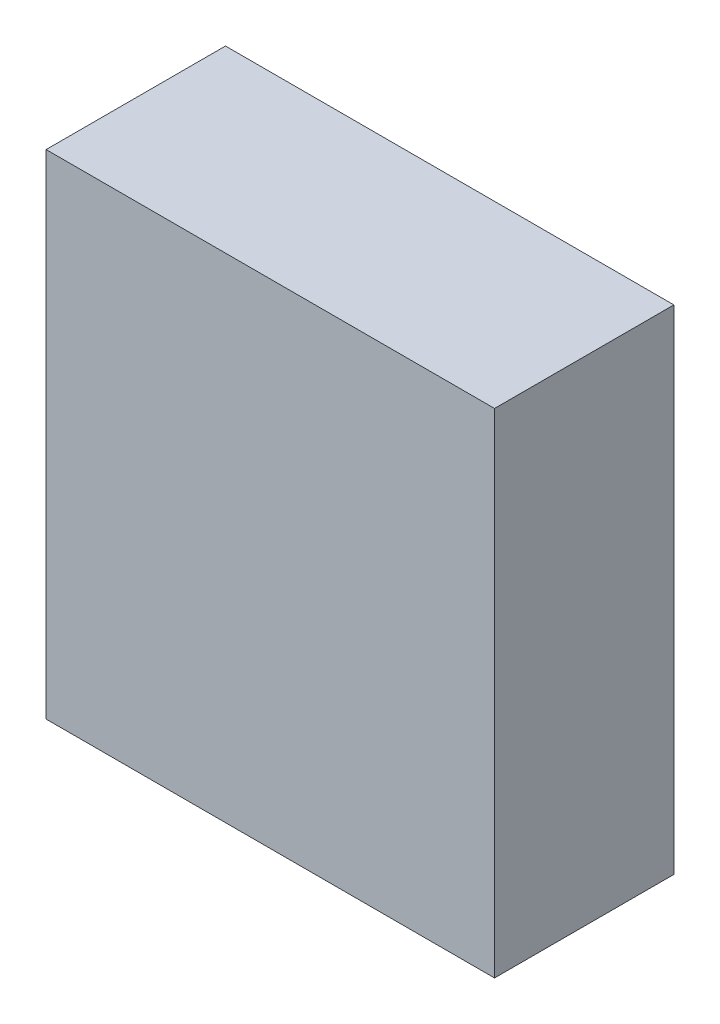
ISO-10303-21;
HEADER;
FILE_DESCRIPTION(('STEP AP214'),'2;1');
FILE_NAME('part.step','',(''),(''),'','','');
FILE_SCHEMA(('AUTOMOTIVE_DESIGN { 1 0 10303 214 1 1 1 1 }'));
ENDSEC;
DATA;
#1=APPLICATION_CONTEXT('core data for automotive mechanical design processes');
#2=APPLICATION_PROTOCOL_DEFINITION('international standard','automotive_design',2000,#1);
#3=PRODUCT_CONTEXT('',#1,'mechanical');
#4=PRODUCT('Part','Part','',(#3));
#5=PRODUCT_RELATED_PRODUCT_CATEGORY('part','',(#4));
#6=PRODUCT_DEFINITION_FORMATION('','',#4);
#7=PRODUCT_DEFINITION_CONTEXT('part definition',#1,'design');
#8=PRODUCT_DEFINITION('design','',#6,#7);
#9=PRODUCT_DEFINITION_SHAPE('','',#8);
#10=(LENGTH_UNIT() NAMED_UNIT(*) SI_UNIT(.MILLI.,.METRE.));
#11=(NAMED_UNIT(*) PLANE_ANGLE_UNIT() SI_UNIT($,.RADIAN.));
#12=(NAMED_UNIT(*) SI_UNIT($,.STERADIAN.) SOLID_ANGLE_UNIT());
#13=UNCERTAINTY_MEASURE_WITH_UNIT(LENGTH_MEASURE(1.E-05),#10,'distance_accuracy_value','');
#14=(GEOMETRIC_REPRESENTATION_CONTEXT(3) GLOBAL_UNCERTAINTY_ASSIGNED_CONTEXT((#13)) GLOBAL_UNIT_ASSIGNED_CONTEXT((#10,
#11,#12)) REPRESENTATION_CONTEXT('',''));
#15=CARTESIAN_POINT('',(0.,0.,0.));
#16=DIRECTION('',(0.,0.,1.));
#17=DIRECTION('',(1.,0.,0.));
#18=AXIS2_PLACEMENT_3D('',#15,#16,#17);
#19=CARTESIAN_POINT('',(0.,275.,0.));
#20=DIRECTION('',(1.,0.,0.));
#21=DIRECTION('',(0.,0.,-1.));
#22=AXIS2_PLACEMENT_3D('',#19,#20,#21);
#23=PLANE('',#22);
#24=DIRECTION('',(0.,0.,1.));
#25=VECTOR('',#24,1.);
#26=CARTESIAN_POINT('',(0.,0.,0.));
#27=LINE('',#26,#25);
#28=CARTESIAN_POINT('',(0.,0.,-100.));
#29=VERTEX_POINT('',#28);
#30=CARTESIAN_POINT('',(0.,0.,0.));
#31=VERTEX_POINT('',#30);
#32=EDGE_CURVE('E107',#29,#31,#27,.T.);
#33=ORIENTED_EDGE('',*,*,#32,.T.);
#34=DIRECTION('',(0.,-1.,0.));
#35=VECTOR('',#34,1.);
#36=CARTESIAN_POINT('',(0.,275.,0.));
#37=LINE('',#36,#35);
#38=CARTESIAN_POINT('',(0.,275.,0.));
#39=VERTEX_POINT('',#38);
#40=EDGE_CURVE('E11',#39,#31,#37,.T.);
#41=ORIENTED_EDGE('',*,*,#40,.F.);
#42=DIRECTION('',(0.,0.,1.));
#43=VECTOR('',#42,1.);
#44=CARTESIAN_POINT('',(0.,275.,0.));
#45=LINE('',#44,#43);
#46=CARTESIAN_POINT('',(0.,275.,-100.));
#47=VERTEX_POINT('',#46);
#48=EDGE_CURVE('E91',#47,#39,#45,.T.);
#49=ORIENTED_EDGE('',*,*,#48,.F.);
#50=DIRECTION('',(0.,-1.,0.));
#51=VECTOR('',#50,1.);
#52=CARTESIAN_POINT('',(0.,275.,-100.));
#53=LINE('',#52,#51);
#54=EDGE_CURVE('E103',#47,#29,#53,.T.);
#55=ORIENTED_EDGE('',*,*,#54,.T.);
#56=EDGE_LOOP('',(#33,#41,#49,#55));
#57=FACE_BOUND('',#56,.T.);
#58=ADVANCED_FACE('F39',(#57),#23,.F.);
#59=CARTESIAN_POINT('',(0.,275.,0.));
#60=DIRECTION('',(0.,0.,-1.));
#61=DIRECTION('',(-1.,0.,0.));
#62=AXIS2_PLACEMENT_3D('',#59,#60,#61);
#63=PLANE('',#62);
#64=DIRECTION('',(1.,0.,0.));
#65=VECTOR('',#64,1.);
#66=CARTESIAN_POINT('',(0.,0.,0.));
#67=LINE('',#66,#65);
#68=CARTESIAN_POINT('',(250.,0.,0.));
#69=VERTEX_POINT('',#68);
#70=EDGE_CURVE('E96',#31,#69,#67,.T.);
#71=ORIENTED_EDGE('',*,*,#70,.T.);
#72=DIRECTION('',(0.,-1.,0.));
#73=VECTOR('',#72,1.);
#74=CARTESIAN_POINT('',(250.,275.,0.));
#75=LINE('',#74,#73);
#76=CARTESIAN_POINT('',(250.,275.,0.));
#77=VERTEX_POINT('',#76);
#78=EDGE_CURVE('E48',#77,#69,#75,.T.);
#79=ORIENTED_EDGE('',*,*,#78,.F.);
#80=DIRECTION('',(1.,0.,0.));
#81=VECTOR('',#80,1.);
#82=CARTESIAN_POINT('',(0.,275.,0.));
#83=LINE('',#82,#81);
#84=EDGE_CURVE('E86',#39,#77,#83,.T.);
#85=ORIENTED_EDGE('',*,*,#84,.F.);
#86=ORIENTED_EDGE('',*,*,#40,.T.);
#87=EDGE_LOOP('',(#71,#79,#85,#86));
#88=FACE_BOUND('',#87,.T.);
#89=ADVANCED_FACE('F95',(#88),#63,.F.);
#90=CARTESIAN_POINT('',(250.,275.,0.));
#91=DIRECTION('',(-1.,0.,0.));
#92=DIRECTION('',(0.,0.,1.));
#93=AXIS2_PLACEMENT_3D('',#90,#91,#92);
#94=PLANE('',#93);
#95=DIRECTION('',(0.,0.,-1.));
#96=VECTOR('',#95,1.);
#97=CARTESIAN_POINT('',(250.,0.,0.));
#98=LINE('',#97,#96);
#99=CARTESIAN_POINT('',(250.,0.,-100.));
#100=VERTEX_POINT('',#99);
#101=EDGE_CURVE('E73',#69,#100,#98,.T.);
#102=ORIENTED_EDGE('',*,*,#101,.T.);
#103=DIRECTION('',(0.,-1.,0.));
#104=VECTOR('',#103,1.);
#105=CARTESIAN_POINT('',(250.,275.,-100.));
#106=LINE('',#105,#104);
#107=CARTESIAN_POINT('',(250.,275.,-100.));
#108=VERTEX_POINT('',#107);
#109=EDGE_CURVE('E98',#108,#100,#106,.T.);
#110=ORIENTED_EDGE('',*,*,#109,.F.);
#111=DIRECTION('',(0.,0.,-1.));
#112=VECTOR('',#111,1.);
#113=CARTESIAN_POINT('',(250.,275.,0.));
#114=LINE('',#113,#112);
#115=EDGE_CURVE('E89',#77,#108,#114,.T.);
#116=ORIENTED_EDGE('',*,*,#115,.F.);
#117=ORIENTED_EDGE('',*,*,#78,.T.);
#118=EDGE_LOOP('',(#102,#110,#116,#117));
#119=FACE_BOUND('',#118,.T.);
#120=ADVANCED_FACE('F99',(#119),#94,.F.);
#121=CARTESIAN_POINT('',(0.,275.,-100.));
#122=DIRECTION('',(0.,0.,1.));
#123=DIRECTION('',(1.,0.,0.));
#124=AXIS2_PLACEMENT_3D('',#121,#122,#123);
#125=PLANE('',#124);
#126=DIRECTION('',(-1.,0.,0.));
#127=VECTOR('',#126,1.);
#128=CARTESIAN_POINT('',(0.,0.,-100.));
#129=LINE('',#128,#127);
#130=EDGE_CURVE('E79',#100,#29,#129,.T.);
#131=ORIENTED_EDGE('',*,*,#130,.T.);
#132=ORIENTED_EDGE('',*,*,#54,.F.);
#133=DIRECTION('',(-1.,0.,0.));
#134=VECTOR('',#133,1.);
#135=CARTESIAN_POINT('',(0.,275.,-100.));
#136=LINE('',#135,#134);
#137=EDGE_CURVE('E56',#108,#47,#136,.T.);
#138=ORIENTED_EDGE('',*,*,#137,.F.);
#139=ORIENTED_EDGE('',*,*,#109,.T.);
#140=EDGE_LOOP('',(#131,#132,#138,#139));
#141=FACE_BOUND('',#140,.T.);
#142=ADVANCED_FACE('F120',(#141),#125,.F.);
#143=CARTESIAN_POINT('',(0.,275.,0.));
#144=DIRECTION('',(0.,-1.,0.));
#145=DIRECTION('',(0.,0.,-1.));
#146=AXIS2_PLACEMENT_3D('',#143,#144,#145);
#147=PLANE('',#146);
#148=ORIENTED_EDGE('',*,*,#48,.T.);
#149=ORIENTED_EDGE('',*,*,#84,.T.);
#150=ORIENTED_EDGE('',*,*,#115,.T.);
#151=ORIENTED_EDGE('',*,*,#137,.T.);
#152=EDGE_LOOP('',(#148,#149,#150,#151));
#153=FACE_BOUND('',#152,.T.);
#154=ADVANCED_FACE('F87',(#153),#147,.F.);
#155=CARTESIAN_POINT('',(0.,0.,0.));
#156=DIRECTION('',(0.,-1.,0.));
#157=DIRECTION('',(0.,0.,-1.));
#158=AXIS2_PLACEMENT_3D('',#155,#156,#157);
#159=PLANE('',#158);
#160=ORIENTED_EDGE('',*,*,#32,.F.);
#161=ORIENTED_EDGE('',*,*,#130,.F.);
#162=ORIENTED_EDGE('',*,*,#101,.F.);
#163=ORIENTED_EDGE('',*,*,#70,.F.);
#164=EDGE_LOOP('',(#160,#161,#162,#163));
#165=FACE_BOUND('',#164,.T.);
#166=ADVANCED_FACE('F123',(#165),#159,.T.);
#167=CLOSED_SHELL('',(#58,#89,#120,#142,#154,#166));
#168=MANIFOLD_SOLID_BREP('B2',#167);
#169=ADVANCED_BREP_SHAPE_REPRESENTATION('',(#18,#168),#14);
#170=SHAPE_DEFINITION_REPRESENTATION(#9,#169);
ENDSEC;
END-ISO-10303-21;
